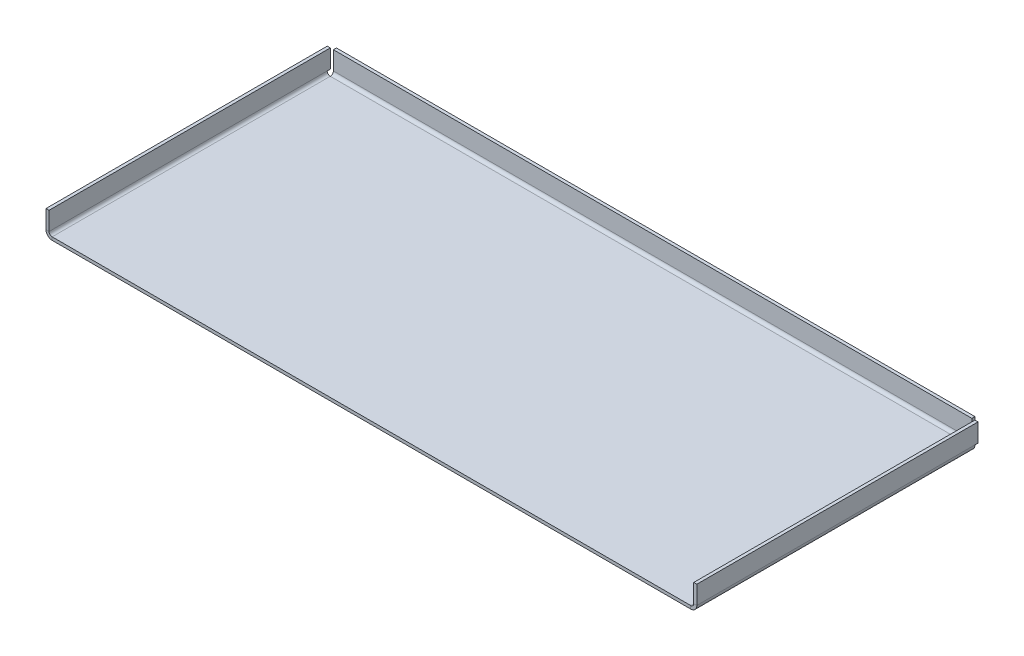
ISO-10303-21;
HEADER;
FILE_DESCRIPTION(('STEP AP214'),'2;1');
FILE_NAME('part.step','',(''),(''),'','','');
FILE_SCHEMA(('AUTOMOTIVE_DESIGN { 1 0 10303 214 1 1 1 1 }'));
ENDSEC;
DATA;
#1=APPLICATION_CONTEXT('core data for automotive mechanical design processes');
#2=APPLICATION_PROTOCOL_DEFINITION('international standard','automotive_design',2000,#1);
#3=PRODUCT_CONTEXT('',#1,'mechanical');
#4=PRODUCT('Part','Part','',(#3));
#5=PRODUCT_RELATED_PRODUCT_CATEGORY('part','',(#4));
#6=PRODUCT_DEFINITION_FORMATION('','',#4);
#7=PRODUCT_DEFINITION_CONTEXT('part definition',#1,'design');
#8=PRODUCT_DEFINITION('design','',#6,#7);
#9=PRODUCT_DEFINITION_SHAPE('','',#8);
#10=(LENGTH_UNIT() NAMED_UNIT(*) SI_UNIT(.MILLI.,.METRE.));
#11=(NAMED_UNIT(*) PLANE_ANGLE_UNIT() SI_UNIT($,.RADIAN.));
#12=(NAMED_UNIT(*) SI_UNIT($,.STERADIAN.) SOLID_ANGLE_UNIT());
#13=UNCERTAINTY_MEASURE_WITH_UNIT(LENGTH_MEASURE(1.E-05),#10,'distance_accuracy_value','');
#14=(GEOMETRIC_REPRESENTATION_CONTEXT(3) GLOBAL_UNCERTAINTY_ASSIGNED_CONTEXT((#13)) GLOBAL_UNIT_ASSIGNED_CONTEXT((#10,
#11,#12)) REPRESENTATION_CONTEXT('',''));
#15=CARTESIAN_POINT('',(0.,0.,0.));
#16=DIRECTION('',(0.,0.,1.));
#17=DIRECTION('',(1.,0.,0.));
#18=AXIS2_PLACEMENT_3D('',#15,#16,#17);
#19=CARTESIAN_POINT('',(0.,3.17499999999998,0.));
#20=DIRECTION('',(0.,-1.,0.));
#21=DIRECTION('',(1.,0.,0.));
#22=AXIS2_PLACEMENT_3D('',#19,#20,#21);
#23=PLANE('',#22);
#24=DIRECTION('',(1.,0.,0.));
#25=VECTOR('',#24,1.);
#26=CARTESIAN_POINT('',(0.,3.17499999999998,-287.655));
#27=LINE('',#26,#25);
#28=CARTESIAN_POINT('',(0.,3.17499999999998,-287.655));
#29=VERTEX_POINT('',#28);
#30=CARTESIAN_POINT('',(3.17499999999999,3.17499999999999,-287.655));
#31=VERTEX_POINT('',#30);
#32=EDGE_CURVE('E13',#29,#31,#27,.T.);
#33=ORIENTED_EDGE('',*,*,#32,.F.);
#34=DIRECTION('',(0.,0.,1.));
#35=VECTOR('',#34,1.);
#36=CARTESIAN_POINT('',(0.,3.17499999999998,0.));
#37=LINE('',#36,#35);
#38=CARTESIAN_POINT('',(0.,3.17499999999998,-290.83));
#39=VERTEX_POINT('',#38);
#40=EDGE_CURVE('E289',#39,#29,#37,.T.);
#41=ORIENTED_EDGE('',*,*,#40,.F.);
#42=DIRECTION('',(1.,0.,0.));
#43=VECTOR('',#42,1.);
#44=CARTESIAN_POINT('',(0.,3.17499999999998,-290.83));
#45=LINE('',#44,#43);
#46=CARTESIAN_POINT('',(3.17499999999999,3.17499999999999,-290.83));
#47=VERTEX_POINT('',#46);
#48=EDGE_CURVE('E265',#47,#39,#45,.F.);
#49=ORIENTED_EDGE('',*,*,#48,.F.);
#50=DIRECTION('',(0.,0.,-1.));
#51=VECTOR('',#50,1.);
#52=CARTESIAN_POINT('',(3.17499999999999,3.17499999999999,-290.83));
#53=LINE('',#52,#51);
#54=EDGE_CURVE('E296',#47,#31,#53,.F.);
#55=ORIENTED_EDGE('',*,*,#54,.T.);
#56=EDGE_LOOP('',(#33,#41,#49,#55));
#57=FACE_BOUND('',#56,.T.);
#58=ADVANCED_FACE('F82',(#57),#23,.T.);
#59=CARTESIAN_POINT('',(6.35000000000001,3.175,0.));
#60=DIRECTION('',(0.,0.,1.));
#61=DIRECTION('',(-1.,0.,0.));
#62=AXIS2_PLACEMENT_3D('',#59,#60,#61);
#63=CYLINDRICAL_SURFACE('',#62,6.34999999999998);
#64=CARTESIAN_POINT('',(0.,3.17499999999998,0.));
#65=VERTEX_POINT('',#64);
#66=EDGE_CURVE('E292',#29,#65,#37,.T.);
#67=ORIENTED_EDGE('',*,*,#66,.F.);
#68=CARTESIAN_POINT('',(6.34999999999997,3.175,-287.655));
#69=DIRECTION('',(0.,0.,-1.));
#70=DIRECTION('',(0.,1.,0.));
#71=AXIS2_PLACEMENT_3D('',#68,#69,#70);
#72=CIRCLE('',#71,6.34999999999998);
#73=CARTESIAN_POINT('',(6.35000000000019,-3.17500000000018,-287.655));
#74=VERTEX_POINT('',#73);
#75=EDGE_CURVE('E375',#29,#74,#72,.F.);
#76=ORIENTED_EDGE('',*,*,#75,.T.);
#77=DIRECTION('',(0.,0.,1.));
#78=VECTOR('',#77,1.);
#79=CARTESIAN_POINT('',(6.34999999999997,-3.17499999999998,0.));
#80=LINE('',#79,#78);
#81=CARTESIAN_POINT('',(6.34999999999997,-3.17499999999998,0.));
#82=VERTEX_POINT('',#81);
#83=EDGE_CURVE('E301',#82,#74,#80,.F.);
#84=ORIENTED_EDGE('',*,*,#83,.F.);
#85=CARTESIAN_POINT('',(6.35000000000001,3.175,0.));
#86=DIRECTION('',(0.,0.,1.));
#87=DIRECTION('',(1.,0.,0.));
#88=AXIS2_PLACEMENT_3D('',#85,#86,#87);
#89=CIRCLE('',#88,6.34999999999998);
#90=EDGE_CURVE('E305',#65,#82,#89,.T.);
#91=ORIENTED_EDGE('',*,*,#90,.F.);
#92=EDGE_LOOP('',(#67,#76,#84,#91));
#93=FACE_BOUND('',#92,.T.);
#94=ADVANCED_FACE('F409',(#93),#63,.T.);
#95=CARTESIAN_POINT('',(0.,3.17500000000342,0.));
#96=DIRECTION('',(0.,1.,0.));
#97=DIRECTION('',(-1.,0.,0.));
#98=AXIS2_PLACEMENT_3D('',#95,#96,#97);
#99=PLANE('',#98);
#100=DIRECTION('',(1.,0.,0.));
#101=VECTOR('',#100,1.);
#102=CARTESIAN_POINT('',(669.93516,3.17500000000004,-287.655));
#103=LINE('',#102,#101);
#104=CARTESIAN_POINT('',(669.93516,3.17500000000004,-287.655));
#105=VERTEX_POINT('',#104);
#106=CARTESIAN_POINT('',(673.11016,3.17500000000002,-287.655));
#107=VERTEX_POINT('',#106);
#108=EDGE_CURVE('E373',#105,#107,#103,.T.);
#109=ORIENTED_EDGE('',*,*,#108,.F.);
#110=DIRECTION('',(0.,0.,-1.));
#111=VECTOR('',#110,1.);
#112=CARTESIAN_POINT('',(669.93516,3.17500000000004,0.));
#113=LINE('',#112,#111);
#114=CARTESIAN_POINT('',(669.93516,3.17500000000004,-290.83));
#115=VERTEX_POINT('',#114);
#116=EDGE_CURVE('E346',#105,#115,#113,.T.);
#117=ORIENTED_EDGE('',*,*,#116,.T.);
#118=DIRECTION('',(-1.,0.,0.));
#119=VECTOR('',#118,1.);
#120=CARTESIAN_POINT('',(669.93516,3.17500000000004,-290.83));
#121=LINE('',#120,#119);
#122=CARTESIAN_POINT('',(673.11016,3.17500000000002,-290.83));
#123=VERTEX_POINT('',#122);
#124=EDGE_CURVE('E341',#115,#123,#121,.F.);
#125=ORIENTED_EDGE('',*,*,#124,.T.);
#126=DIRECTION('',(0.,0.,-1.));
#127=VECTOR('',#126,1.);
#128=CARTESIAN_POINT('',(673.11016,3.17500000000002,0.));
#129=LINE('',#128,#127);
#130=EDGE_CURVE('E337',#123,#107,#129,.F.);
#131=ORIENTED_EDGE('',*,*,#130,.T.);
#132=EDGE_LOOP('',(#109,#117,#125,#131));
#133=FACE_BOUND('',#132,.T.);
#134=ADVANCED_FACE('F448',(#133),#99,.F.);
#135=CARTESIAN_POINT('',(666.76016,3.17500000000005,-290.83));
#136=DIRECTION('',(0.,0.,-1.));
#137=DIRECTION('',(1.,0.,0.));
#138=AXIS2_PLACEMENT_3D('',#135,#136,#137);
#139=CYLINDRICAL_SURFACE('',#138,6.35000000000004);
#140=DIRECTION('',(0.,0.,-1.));
#141=VECTOR('',#140,1.);
#142=CARTESIAN_POINT('',(666.76016,-3.17499999999998,-290.83));
#143=LINE('',#142,#141);
#144=CARTESIAN_POINT('',(666.76016,-3.17499999999998,-287.655));
#145=VERTEX_POINT('',#144);
#146=CARTESIAN_POINT('',(666.76016,-3.175,0.));
#147=VERTEX_POINT('',#146);
#148=EDGE_CURVE('E349',#145,#147,#143,.F.);
#149=ORIENTED_EDGE('',*,*,#148,.F.);
#150=CARTESIAN_POINT('',(666.76016,3.17500000000005,-287.655));
#151=DIRECTION('',(0.,0.,-1.));
#152=DIRECTION('',(0.,1.,0.));
#153=AXIS2_PLACEMENT_3D('',#150,#151,#152);
#154=CIRCLE('',#153,6.35000000000004);
#155=EDGE_CURVE('E370',#145,#107,#154,.F.);
#156=ORIENTED_EDGE('',*,*,#155,.T.);
#157=CARTESIAN_POINT('',(673.11016,3.17500000000002,0.));
#158=VERTEX_POINT('',#157);
#159=EDGE_CURVE('E340',#107,#158,#129,.F.);
#160=ORIENTED_EDGE('',*,*,#159,.T.);
#161=CARTESIAN_POINT('',(666.76016,3.17500000000005,0.));
#162=DIRECTION('',(0.,0.,-1.));
#163=DIRECTION('',(-1.,0.,0.));
#164=AXIS2_PLACEMENT_3D('',#161,#162,#163);
#165=CIRCLE('',#164,6.35000000000004);
#166=EDGE_CURVE('E351',#147,#158,#165,.F.);
#167=ORIENTED_EDGE('',*,*,#166,.F.);
#168=EDGE_LOOP('',(#149,#156,#160,#167));
#169=FACE_BOUND('',#168,.T.);
#170=ADVANCED_FACE('F419',(#169),#139,.T.);
#171=CARTESIAN_POINT('',(666.76016,3.17500000000005,-287.655));
#172=DIRECTION('',(0.,0.,-1.));
#173=DIRECTION('',(0.,1.,0.));
#174=AXIS2_PLACEMENT_3D('',#171,#172,#173);
#175=PLANE('',#174);
#176=CARTESIAN_POINT('',(666.76016,3.17500000000005,-287.655));
#177=DIRECTION('',(0.,0.,-1.));
#178=DIRECTION('',(0.,1.,0.));
#179=AXIS2_PLACEMENT_3D('',#176,#177,#178);
#180=CIRCLE('',#179,3.17500000000004);
#181=CARTESIAN_POINT('',(666.76016,-1.38777878078145E-13,-287.655));
#182=VERTEX_POINT('',#181);
#183=EDGE_CURVE('E365',#182,#105,#180,.F.);
#184=ORIENTED_EDGE('',*,*,#183,.T.);
#185=ORIENTED_EDGE('',*,*,#108,.T.);
#186=ORIENTED_EDGE('',*,*,#155,.F.);
#187=DIRECTION('',(0.,-1.,0.));
#188=VECTOR('',#187,1.);
#189=CARTESIAN_POINT('',(666.76016,-1.38777878078145E-13,-287.655));
#190=LINE('',#189,#188);
#191=EDGE_CURVE('E262',#182,#145,#190,.T.);
#192=ORIENTED_EDGE('',*,*,#191,.F.);
#193=EDGE_LOOP('',(#184,#185,#186,#192));
#194=FACE_BOUND('',#193,.T.);
#195=ADVANCED_FACE('F486',(#194),#175,.T.);
#196=CARTESIAN_POINT('',(0.,-3.175,0.));
#197=DIRECTION('',(0.,-1.,0.));
#198=DIRECTION('',(0.,0.,-1.));
#199=AXIS2_PLACEMENT_3D('',#196,#197,#198);
#200=PLANE('',#199);
#201=ORIENTED_EDGE('',*,*,#83,.T.);
#202=DIRECTION('',(-1.,0.,0.));
#203=VECTOR('',#202,1.);
#204=CARTESIAN_POINT('',(6.34999999999997,-3.17500000000018,-287.655));
#205=LINE('',#204,#203);
#206=EDGE_CURVE('E209',#74,#145,#205,.F.);
#207=ORIENTED_EDGE('',*,*,#206,.T.);
#208=ORIENTED_EDGE('',*,*,#148,.T.);
#209=DIRECTION('',(1.,0.,0.));
#210=VECTOR('',#209,1.);
#211=CARTESIAN_POINT('',(0.,-3.175,0.));
#212=LINE('',#211,#210);
#213=EDGE_CURVE('E362',#82,#147,#212,.T.);
#214=ORIENTED_EDGE('',*,*,#213,.F.);
#215=EDGE_LOOP('',(#201,#207,#208,#214));
#216=FACE_BOUND('',#215,.T.);
#217=ADVANCED_FACE('F415',(#216),#200,.T.);
#218=CARTESIAN_POINT('',(0.,0.,0.));
#219=DIRECTION('',(0.,-1.,0.));
#220=DIRECTION('',(0.,0.,-1.));
#221=AXIS2_PLACEMENT_3D('',#218,#219,#220);
#222=PLANE('',#221);
#223=DIRECTION('',(-1.,0.,0.));
#224=VECTOR('',#223,1.);
#225=CARTESIAN_POINT('',(6.34999999999997,-1.83880688453542E-13,-287.655));
#226=LINE('',#225,#224);
#227=CARTESIAN_POINT('',(6.35000000000019,-1.83880688453542E-13,-287.655));
#228=VERTEX_POINT('',#227);
#229=EDGE_CURVE('E259',#228,#182,#226,.F.);
#230=ORIENTED_EDGE('',*,*,#229,.F.);
#231=DIRECTION('',(0.,0.,1.));
#232=VECTOR('',#231,1.);
#233=CARTESIAN_POINT('',(6.34999999999999,0.,0.));
#234=LINE('',#233,#232);
#235=CARTESIAN_POINT('',(6.34999999999999,0.,0.));
#236=VERTEX_POINT('',#235);
#237=EDGE_CURVE('E308',#236,#228,#234,.F.);
#238=ORIENTED_EDGE('',*,*,#237,.F.);
#239=DIRECTION('',(1.,0.,0.));
#240=VECTOR('',#239,1.);
#241=CARTESIAN_POINT('',(0.,0.,0.));
#242=LINE('',#241,#240);
#243=CARTESIAN_POINT('',(666.76016,0.,0.));
#244=VERTEX_POINT('',#243);
#245=EDGE_CURVE('E361',#236,#244,#242,.T.);
#246=ORIENTED_EDGE('',*,*,#245,.T.);
#247=DIRECTION('',(0.,0.,-1.));
#248=VECTOR('',#247,1.);
#249=CARTESIAN_POINT('',(666.76016,0.,-290.83));
#250=LINE('',#249,#248);
#251=EDGE_CURVE('E319',#182,#244,#250,.F.);
#252=ORIENTED_EDGE('',*,*,#251,.F.);
#253=EDGE_LOOP('',(#230,#238,#246,#252));
#254=FACE_BOUND('',#253,.T.);
#255=ADVANCED_FACE('F383',(#254),#222,.F.);
#256=CARTESIAN_POINT('',(0.,-3.175,0.));
#257=DIRECTION('',(0.,0.,1.));
#258=DIRECTION('',(1.,0.,0.));
#259=AXIS2_PLACEMENT_3D('',#256,#257,#258);
#260=PLANE('',#259);
#261=ORIENTED_EDGE('',*,*,#245,.F.);
#262=DIRECTION('',(0.,-1.,0.));
#263=VECTOR('',#262,1.);
#264=CARTESIAN_POINT('',(6.34999999999999,0.,0.));
#265=LINE('',#264,#263);
#266=EDGE_CURVE('E304',#236,#82,#265,.T.);
#267=ORIENTED_EDGE('',*,*,#266,.T.);
#268=ORIENTED_EDGE('',*,*,#213,.T.);
#269=DIRECTION('',(0.,-1.,0.));
#270=VECTOR('',#269,1.);
#271=CARTESIAN_POINT('',(666.76016,0.,0.));
#272=LINE('',#271,#270);
#273=EDGE_CURVE('E355',#244,#147,#272,.T.);
#274=ORIENTED_EDGE('',*,*,#273,.F.);
#275=EDGE_LOOP('',(#261,#267,#268,#274));
#276=FACE_BOUND('',#275,.T.);
#277=ADVANCED_FACE('F412',(#276),#260,.T.);
#278=CARTESIAN_POINT('',(666.76016,3.17500000000005,0.));
#279=DIRECTION('',(0.,0.,1.));
#280=DIRECTION('',(1.,0.,0.));
#281=AXIS2_PLACEMENT_3D('',#278,#279,#280);
#282=PLANE('',#281);
#283=DIRECTION('',(-1.,0.,0.));
#284=VECTOR('',#283,1.);
#285=CARTESIAN_POINT('',(673.11016,3.17500000000002,0.));
#286=LINE('',#285,#284);
#287=CARTESIAN_POINT('',(669.93516,3.17500000000004,0.));
#288=VERTEX_POINT('',#287);
#289=EDGE_CURVE('E315',#288,#158,#286,.F.);
#290=ORIENTED_EDGE('',*,*,#289,.F.);
#291=CARTESIAN_POINT('',(666.76016,3.17500000000005,0.));
#292=DIRECTION('',(0.,0.,-1.));
#293=DIRECTION('',(-1.,0.,0.));
#294=AXIS2_PLACEMENT_3D('',#291,#292,#293);
#295=CIRCLE('',#294,3.17500000000004);
#296=EDGE_CURVE('E352',#244,#288,#295,.F.);
#297=ORIENTED_EDGE('',*,*,#296,.F.);
#298=ORIENTED_EDGE('',*,*,#273,.T.);
#299=ORIENTED_EDGE('',*,*,#166,.T.);
#300=EDGE_LOOP('',(#290,#297,#298,#299));
#301=FACE_BOUND('',#300,.T.);
#302=ADVANCED_FACE('F423',(#301),#282,.T.);
#303=CARTESIAN_POINT('',(666.76016,3.17500000000005,-290.83));
#304=DIRECTION('',(0.,0.,-1.));
#305=DIRECTION('',(1.,0.,0.));
#306=AXIS2_PLACEMENT_3D('',#303,#304,#305);
#307=CYLINDRICAL_SURFACE('',#306,3.17500000000004);
#308=ORIENTED_EDGE('',*,*,#183,.F.);
#309=ORIENTED_EDGE('',*,*,#251,.T.);
#310=ORIENTED_EDGE('',*,*,#296,.T.);
#311=EDGE_CURVE('E343',#288,#105,#113,.T.);
#312=ORIENTED_EDGE('',*,*,#311,.T.);
#313=EDGE_LOOP('',(#308,#309,#310,#312));
#314=FACE_BOUND('',#313,.T.);
#315=ADVANCED_FACE('F427',(#314),#307,.F.);
#316=CARTESIAN_POINT('',(673.11016,22.225,-290.83));
#317=DIRECTION('',(0.,0.,1.));
#318=DIRECTION('',(1.,0.,0.));
#319=AXIS2_PLACEMENT_3D('',#316,#317,#318);
#320=PLANE('',#319);
#321=ORIENTED_EDGE('',*,*,#124,.F.);
#322=DIRECTION('',(0.,-1.,0.));
#323=VECTOR('',#322,1.);
#324=CARTESIAN_POINT('',(669.93516,22.225,-290.83));
#325=LINE('',#324,#323);
#326=CARTESIAN_POINT('',(669.93516,22.225,-290.83));
#327=VERTEX_POINT('',#326);
#328=EDGE_CURVE('E335',#115,#327,#325,.F.);
#329=ORIENTED_EDGE('',*,*,#328,.T.);
#330=DIRECTION('',(-1.,0.,0.));
#331=VECTOR('',#330,1.);
#332=CARTESIAN_POINT('',(673.11016,22.225,-290.83));
#333=LINE('',#332,#331);
#334=CARTESIAN_POINT('',(673.11016,22.225,-290.83));
#335=VERTEX_POINT('',#334);
#336=EDGE_CURVE('E316',#335,#327,#333,.T.);
#337=ORIENTED_EDGE('',*,*,#336,.F.);
#338=DIRECTION('',(0.,1.,0.));
#339=VECTOR('',#338,1.);
#340=CARTESIAN_POINT('',(673.11016,-3.37352593802528E-12,-290.83));
#341=LINE('',#340,#339);
#342=EDGE_CURVE('E328',#123,#335,#341,.T.);
#343=ORIENTED_EDGE('',*,*,#342,.F.);
#344=EDGE_LOOP('',(#321,#329,#337,#343));
#345=FACE_BOUND('',#344,.T.);
#346=ADVANCED_FACE('F444',(#345),#320,.F.);
#347=CARTESIAN_POINT('',(673.11016,0.,0.));
#348=DIRECTION('',(0.,0.,-1.));
#349=DIRECTION('',(-1.,0.,0.));
#350=AXIS2_PLACEMENT_3D('',#347,#348,#349);
#351=PLANE('',#350);
#352=ORIENTED_EDGE('',*,*,#289,.T.);
#353=DIRECTION('',(0.,-1.,0.));
#354=VECTOR('',#353,1.);
#355=CARTESIAN_POINT('',(673.11016,-3.37352593802528E-12,0.));
#356=LINE('',#355,#354);
#357=CARTESIAN_POINT('',(673.11016,22.225,0.));
#358=VERTEX_POINT('',#357);
#359=EDGE_CURVE('E323',#358,#158,#356,.T.);
#360=ORIENTED_EDGE('',*,*,#359,.F.);
#361=DIRECTION('',(-1.,0.,0.));
#362=VECTOR('',#361,1.);
#363=CARTESIAN_POINT('',(673.11016,22.225,0.));
#364=LINE('',#363,#362);
#365=CARTESIAN_POINT('',(669.93516,22.225,0.));
#366=VERTEX_POINT('',#365);
#367=EDGE_CURVE('E320',#358,#366,#364,.T.);
#368=ORIENTED_EDGE('',*,*,#367,.T.);
#369=DIRECTION('',(0.,1.,0.));
#370=VECTOR('',#369,1.);
#371=CARTESIAN_POINT('',(669.93516,0.,0.));
#372=LINE('',#371,#370);
#373=EDGE_CURVE('E330',#366,#288,#372,.F.);
#374=ORIENTED_EDGE('',*,*,#373,.T.);
#375=EDGE_LOOP('',(#352,#360,#368,#374));
#376=FACE_BOUND('',#375,.T.);
#377=ADVANCED_FACE('F435',(#376),#351,.F.);
#378=CARTESIAN_POINT('',(673.11016,-3.37352593802528E-12,0.));
#379=DIRECTION('',(-1.,0.,0.));
#380=DIRECTION('',(0.,-1.,0.));
#381=AXIS2_PLACEMENT_3D('',#378,#379,#380);
#382=PLANE('',#381);
#383=ORIENTED_EDGE('',*,*,#130,.F.);
#384=ORIENTED_EDGE('',*,*,#342,.T.);
#385=DIRECTION('',(0.,0.,1.));
#386=VECTOR('',#385,1.);
#387=CARTESIAN_POINT('',(673.11016,22.225,0.));
#388=LINE('',#387,#386);
#389=EDGE_CURVE('E326',#335,#358,#388,.T.);
#390=ORIENTED_EDGE('',*,*,#389,.T.);
#391=ORIENTED_EDGE('',*,*,#359,.T.);
#392=ORIENTED_EDGE('',*,*,#159,.F.);
#393=EDGE_LOOP('',(#383,#384,#390,#391,#392));
#394=FACE_BOUND('',#393,.T.);
#395=ADVANCED_FACE('F450',(#394),#382,.F.);
#396=CARTESIAN_POINT('',(669.93516,-3.36244048477446E-12,0.));
#397=DIRECTION('',(-1.,0.,0.));
#398=DIRECTION('',(0.,-1.,0.));
#399=AXIS2_PLACEMENT_3D('',#396,#397,#398);
#400=PLANE('',#399);
#401=ORIENTED_EDGE('',*,*,#328,.F.);
#402=ORIENTED_EDGE('',*,*,#116,.F.);
#403=ORIENTED_EDGE('',*,*,#311,.F.);
#404=ORIENTED_EDGE('',*,*,#373,.F.);
#405=DIRECTION('',(0.,0.,-1.));
#406=VECTOR('',#405,1.);
#407=CARTESIAN_POINT('',(669.93516,22.225,0.));
#408=LINE('',#407,#406);
#409=EDGE_CURVE('E333',#327,#366,#408,.F.);
#410=ORIENTED_EDGE('',*,*,#409,.F.);
#411=EDGE_LOOP('',(#401,#402,#403,#404,#410));
#412=FACE_BOUND('',#411,.T.);
#413=ADVANCED_FACE('F432',(#412),#400,.T.);
#414=CARTESIAN_POINT('',(673.11016,22.225,0.));
#415=DIRECTION('',(0.,-1.,0.));
#416=DIRECTION('',(1.,0.,0.));
#417=AXIS2_PLACEMENT_3D('',#414,#415,#416);
#418=PLANE('',#417);
#419=ORIENTED_EDGE('',*,*,#409,.T.);
#420=ORIENTED_EDGE('',*,*,#367,.F.);
#421=ORIENTED_EDGE('',*,*,#389,.F.);
#422=ORIENTED_EDGE('',*,*,#336,.T.);
#423=EDGE_LOOP('',(#419,#420,#421,#422));
#424=FACE_BOUND('',#423,.T.);
#425=ADVANCED_FACE('F440',(#424),#418,.F.);
#426=CARTESIAN_POINT('',(6.35000000000001,3.175,0.));
#427=DIRECTION('',(0.,0.,-1.));
#428=DIRECTION('',(-1.,0.,0.));
#429=AXIS2_PLACEMENT_3D('',#426,#427,#428);
#430=PLANE('',#429);
#431=CARTESIAN_POINT('',(6.35000000000001,3.175,0.));
#432=DIRECTION('',(0.,0.,1.));
#433=DIRECTION('',(1.,0.,0.));
#434=AXIS2_PLACEMENT_3D('',#431,#432,#433);
#435=CIRCLE('',#434,3.17499999999998);
#436=CARTESIAN_POINT('',(3.17500000000003,3.17499999999999,0.));
#437=VERTEX_POINT('',#436);
#438=EDGE_CURVE('E271',#437,#236,#435,.T.);
#439=ORIENTED_EDGE('',*,*,#438,.F.);
#440=DIRECTION('',(1.,0.,0.));
#441=VECTOR('',#440,1.);
#442=CARTESIAN_POINT('',(3.17499999999999,3.17499999999999,0.));
#443=LINE('',#442,#441);
#444=EDGE_CURVE('E293',#437,#65,#443,.F.);
#445=ORIENTED_EDGE('',*,*,#444,.T.);
#446=ORIENTED_EDGE('',*,*,#90,.T.);
#447=ORIENTED_EDGE('',*,*,#266,.F.);
#448=EDGE_LOOP('',(#439,#445,#446,#447));
#449=FACE_BOUND('',#448,.T.);
#450=ADVANCED_FACE('F391',(#449),#430,.F.);
#451=CARTESIAN_POINT('',(6.34999999999997,3.175,-287.655));
#452=DIRECTION('',(0.,0.,-1.));
#453=DIRECTION('',(0.,1.,0.));
#454=AXIS2_PLACEMENT_3D('',#451,#452,#453);
#455=PLANE('',#454);
#456=ORIENTED_EDGE('',*,*,#75,.F.);
#457=ORIENTED_EDGE('',*,*,#32,.T.);
#458=CARTESIAN_POINT('',(6.34999999999997,3.175,-287.655));
#459=DIRECTION('',(0.,0.,-1.));
#460=DIRECTION('',(0.,1.,0.));
#461=AXIS2_PLACEMENT_3D('',#458,#459,#460);
#462=CIRCLE('',#461,3.17499999999998);
#463=EDGE_CURVE('E89',#31,#228,#462,.F.);
#464=ORIENTED_EDGE('',*,*,#463,.T.);
#465=DIRECTION('',(0.,-1.,0.));
#466=VECTOR('',#465,1.);
#467=CARTESIAN_POINT('',(6.35000000000019,-1.83880688453542E-13,-287.655));
#468=LINE('',#467,#466);
#469=EDGE_CURVE('E255',#228,#74,#468,.T.);
#470=ORIENTED_EDGE('',*,*,#469,.T.);
#471=EDGE_LOOP('',(#456,#457,#464,#470));
#472=FACE_BOUND('',#471,.T.);
#473=ADVANCED_FACE('F377',(#472),#455,.T.);
#474=CARTESIAN_POINT('',(6.35000000000001,3.175,0.));
#475=DIRECTION('',(0.,0.,1.));
#476=DIRECTION('',(-1.,0.,0.));
#477=AXIS2_PLACEMENT_3D('',#474,#475,#476);
#478=CYLINDRICAL_SURFACE('',#477,3.17499999999998);
#479=ORIENTED_EDGE('',*,*,#463,.F.);
#480=EDGE_CURVE('E298',#31,#437,#53,.F.);
#481=ORIENTED_EDGE('',*,*,#480,.T.);
#482=ORIENTED_EDGE('',*,*,#438,.T.);
#483=ORIENTED_EDGE('',*,*,#237,.T.);
#484=EDGE_LOOP('',(#479,#481,#482,#483));
#485=FACE_BOUND('',#484,.T.);
#486=ADVANCED_FACE('F387',(#485),#478,.F.);
#487=CARTESIAN_POINT('',(0.,0.,0.));
#488=DIRECTION('',(0.,0.,-1.));
#489=DIRECTION('',(0.,1.,0.));
#490=AXIS2_PLACEMENT_3D('',#487,#488,#489);
#491=PLANE('',#490);
#492=ORIENTED_EDGE('',*,*,#444,.F.);
#493=DIRECTION('',(0.,1.,0.));
#494=VECTOR('',#493,1.);
#495=CARTESIAN_POINT('',(3.175,0.,0.));
#496=LINE('',#495,#494);
#497=CARTESIAN_POINT('',(3.17499999999992,22.225,0.));
#498=VERTEX_POINT('',#497);
#499=EDGE_CURVE('E287',#437,#498,#496,.T.);
#500=ORIENTED_EDGE('',*,*,#499,.T.);
#501=DIRECTION('',(1.,0.,0.));
#502=VECTOR('',#501,1.);
#503=CARTESIAN_POINT('',(0.,22.225,0.));
#504=LINE('',#503,#502);
#505=CARTESIAN_POINT('',(0.,22.225,0.));
#506=VERTEX_POINT('',#505);
#507=EDGE_CURVE('E268',#506,#498,#504,.T.);
#508=ORIENTED_EDGE('',*,*,#507,.F.);
#509=DIRECTION('',(0.,-1.,0.));
#510=VECTOR('',#509,1.);
#511=CARTESIAN_POINT('',(0.,0.,0.));
#512=LINE('',#511,#510);
#513=EDGE_CURVE('E280',#65,#506,#512,.F.);
#514=ORIENTED_EDGE('',*,*,#513,.F.);
#515=EDGE_LOOP('',(#492,#500,#508,#514));
#516=FACE_BOUND('',#515,.T.);
#517=ADVANCED_FACE('F401',(#516),#491,.F.);
#518=CARTESIAN_POINT('',(0.,22.225,-290.83));
#519=DIRECTION('',(0.,0.,1.));
#520=DIRECTION('',(1.,0.,0.));
#521=AXIS2_PLACEMENT_3D('',#518,#519,#520);
#522=PLANE('',#521);
#523=ORIENTED_EDGE('',*,*,#48,.T.);
#524=DIRECTION('',(0.,1.,0.));
#525=VECTOR('',#524,1.);
#526=CARTESIAN_POINT('',(0.,0.,-290.83));
#527=LINE('',#526,#525);
#528=CARTESIAN_POINT('',(0.,22.225,-290.83));
#529=VERTEX_POINT('',#528);
#530=EDGE_CURVE('E275',#529,#39,#527,.F.);
#531=ORIENTED_EDGE('',*,*,#530,.F.);
#532=DIRECTION('',(1.,0.,0.));
#533=VECTOR('',#532,1.);
#534=CARTESIAN_POINT('',(0.,22.225,-290.83));
#535=LINE('',#534,#533);
#536=CARTESIAN_POINT('',(3.17499999999992,22.225,-290.83));
#537=VERTEX_POINT('',#536);
#538=EDGE_CURVE('E272',#529,#537,#535,.T.);
#539=ORIENTED_EDGE('',*,*,#538,.T.);
#540=DIRECTION('',(0.,-1.,0.));
#541=VECTOR('',#540,1.);
#542=CARTESIAN_POINT('',(3.17499999999992,22.225,-290.83));
#543=LINE('',#542,#541);
#544=EDGE_CURVE('E282',#537,#47,#543,.T.);
#545=ORIENTED_EDGE('',*,*,#544,.T.);
#546=EDGE_LOOP('',(#523,#531,#539,#545));
#547=FACE_BOUND('',#546,.T.);
#548=ADVANCED_FACE('F542',(#547),#522,.F.);
#549=CARTESIAN_POINT('',(0.,0.,0.));
#550=DIRECTION('',(-1.,0.,0.));
#551=DIRECTION('',(0.,-1.,0.));
#552=AXIS2_PLACEMENT_3D('',#549,#550,#551);
#553=PLANE('',#552);
#554=ORIENTED_EDGE('',*,*,#530,.T.);
#555=ORIENTED_EDGE('',*,*,#40,.T.);
#556=ORIENTED_EDGE('',*,*,#66,.T.);
#557=ORIENTED_EDGE('',*,*,#513,.T.);
#558=DIRECTION('',(0.,0.,1.));
#559=VECTOR('',#558,1.);
#560=CARTESIAN_POINT('',(0.,22.225,0.));
#561=LINE('',#560,#559);
#562=EDGE_CURVE('E278',#506,#529,#561,.F.);
#563=ORIENTED_EDGE('',*,*,#562,.T.);
#564=EDGE_LOOP('',(#554,#555,#556,#557,#563));
#565=FACE_BOUND('',#564,.T.);
#566=ADVANCED_FACE('F404',(#565),#553,.T.);
#567=CARTESIAN_POINT('',(3.175,0.,0.));
#568=DIRECTION('',(-1.,0.,0.));
#569=DIRECTION('',(0.,-1.,0.));
#570=AXIS2_PLACEMENT_3D('',#567,#568,#569);
#571=PLANE('',#570);
#572=ORIENTED_EDGE('',*,*,#54,.F.);
#573=ORIENTED_EDGE('',*,*,#544,.F.);
#574=DIRECTION('',(0.,0.,-1.));
#575=VECTOR('',#574,1.);
#576=CARTESIAN_POINT('',(3.17499999999992,22.225,0.));
#577=LINE('',#576,#575);
#578=EDGE_CURVE('E285',#498,#537,#577,.T.);
#579=ORIENTED_EDGE('',*,*,#578,.F.);
#580=ORIENTED_EDGE('',*,*,#499,.F.);
#581=ORIENTED_EDGE('',*,*,#480,.F.);
#582=EDGE_LOOP('',(#572,#573,#579,#580,#581));
#583=FACE_BOUND('',#582,.T.);
#584=ADVANCED_FACE('F397',(#583),#571,.F.);
#585=CARTESIAN_POINT('',(0.,22.225,0.));
#586=DIRECTION('',(0.,-1.,0.));
#587=DIRECTION('',(1.,0.,0.));
#588=AXIS2_PLACEMENT_3D('',#585,#586,#587);
#589=PLANE('',#588);
#590=ORIENTED_EDGE('',*,*,#578,.T.);
#591=ORIENTED_EDGE('',*,*,#538,.F.);
#592=ORIENTED_EDGE('',*,*,#562,.F.);
#593=ORIENTED_EDGE('',*,*,#507,.T.);
#594=EDGE_LOOP('',(#590,#591,#592,#593));
#595=FACE_BOUND('',#594,.T.);
#596=ADVANCED_FACE('F537',(#595),#589,.F.);
#597=CARTESIAN_POINT('',(666.76016,3.17499999999996,-287.655));
#598=DIRECTION('',(1.,0.,0.));
#599=DIRECTION('',(0.,1.,0.));
#600=AXIS2_PLACEMENT_3D('',#597,#598,#599);
#601=PLANE('',#600);
#602=DIRECTION('',(0.,0.,-1.));
#603=VECTOR('',#602,1.);
#604=CARTESIAN_POINT('',(666.76016,3.17499999999998,-290.83));
#605=LINE('',#604,#603);
#606=CARTESIAN_POINT('',(666.76016,3.17499999999995,-290.83));
#607=VERTEX_POINT('',#606);
#608=CARTESIAN_POINT('',(666.76016,3.17499999999994,-294.005));
#609=VERTEX_POINT('',#608);
#610=EDGE_CURVE('E506',#607,#609,#605,.T.);
#611=ORIENTED_EDGE('',*,*,#610,.F.);
#612=CARTESIAN_POINT('',(666.76016,3.17499999999996,-287.655));
#613=DIRECTION('',(-1.,0.,0.));
#614=DIRECTION('',(0.,-1.,0.));
#615=AXIS2_PLACEMENT_3D('',#612,#613,#614);
#616=CIRCLE('',#615,3.17500000000009);
#617=EDGE_CURVE('E212',#182,#607,#616,.F.);
#618=ORIENTED_EDGE('',*,*,#617,.F.);
#619=ORIENTED_EDGE('',*,*,#191,.T.);
#620=CARTESIAN_POINT('',(666.76016,3.17499999999996,-287.655));
#621=DIRECTION('',(-1.,0.,0.));
#622=DIRECTION('',(0.,-1.,0.));
#623=AXIS2_PLACEMENT_3D('',#620,#621,#622);
#624=CIRCLE('',#623,6.35000000000009);
#625=EDGE_CURVE('E254',#145,#609,#624,.F.);
#626=ORIENTED_EDGE('',*,*,#625,.T.);
#627=EDGE_LOOP('',(#611,#618,#619,#626));
#628=FACE_BOUND('',#627,.T.);
#629=ADVANCED_FACE('F504',(#628),#601,.T.);
#630=CARTESIAN_POINT('',(6.35000000000019,3.17499999999991,-287.655));
#631=DIRECTION('',(1.,0.,0.));
#632=DIRECTION('',(0.,1.,0.));
#633=AXIS2_PLACEMENT_3D('',#630,#631,#632);
#634=PLANE('',#633);
#635=CARTESIAN_POINT('',(6.35000000000019,3.17499999999991,-287.655));
#636=DIRECTION('',(-1.,0.,0.));
#637=DIRECTION('',(0.,-1.,0.));
#638=AXIS2_PLACEMENT_3D('',#635,#636,#637);
#639=CIRCLE('',#638,3.17500000000009);
#640=CARTESIAN_POINT('',(6.35000000000019,3.1749999999999,-290.83));
#641=VERTEX_POINT('',#640);
#642=EDGE_CURVE('E219',#641,#228,#639,.T.);
#643=ORIENTED_EDGE('',*,*,#642,.F.);
#644=DIRECTION('',(0.,0.,-1.));
#645=VECTOR('',#644,1.);
#646=CARTESIAN_POINT('',(6.35000000000019,3.17499999999993,-290.83));
#647=LINE('',#646,#645);
#648=CARTESIAN_POINT('',(6.35000000000019,3.17499999999995,-294.005));
#649=VERTEX_POINT('',#648);
#650=EDGE_CURVE('E216',#641,#649,#647,.T.);
#651=ORIENTED_EDGE('',*,*,#650,.T.);
#652=CARTESIAN_POINT('',(6.35000000000019,3.17499999999991,-287.655));
#653=DIRECTION('',(-1.,0.,0.));
#654=DIRECTION('',(0.,-1.,0.));
#655=AXIS2_PLACEMENT_3D('',#652,#653,#654);
#656=CIRCLE('',#655,6.35000000000009);
#657=EDGE_CURVE('E202',#649,#74,#656,.T.);
#658=ORIENTED_EDGE('',*,*,#657,.T.);
#659=ORIENTED_EDGE('',*,*,#469,.F.);
#660=EDGE_LOOP('',(#643,#651,#658,#659));
#661=FACE_BOUND('',#660,.T.);
#662=ADVANCED_FACE('F217',(#661),#634,.F.);
#663=CARTESIAN_POINT('',(6.34999999999997,3.17499999999991,-287.655));
#664=DIRECTION('',(-1.,0.,0.));
#665=DIRECTION('',(0.,0.,-1.));
#666=AXIS2_PLACEMENT_3D('',#663,#664,#665);
#667=CYLINDRICAL_SURFACE('',#666,6.35000000000009);
#668=ORIENTED_EDGE('',*,*,#206,.F.);
#669=ORIENTED_EDGE('',*,*,#657,.F.);
#670=DIRECTION('',(1.,0.,0.));
#671=VECTOR('',#670,1.);
#672=CARTESIAN_POINT('',(0.,3.17499999999995,-294.005));
#673=LINE('',#672,#671);
#674=EDGE_CURVE('E206',#649,#609,#673,.T.);
#675=ORIENTED_EDGE('',*,*,#674,.T.);
#676=ORIENTED_EDGE('',*,*,#625,.F.);
#677=EDGE_LOOP('',(#668,#669,#675,#676));
#678=FACE_BOUND('',#677,.T.);
#679=ADVANCED_FACE('F204',(#678),#667,.T.);
#680=CARTESIAN_POINT('',(6.34999999999997,3.17499999999991,-287.655));
#681=DIRECTION('',(-1.,0.,0.));
#682=DIRECTION('',(0.,0.,-1.));
#683=AXIS2_PLACEMENT_3D('',#680,#681,#682);
#684=CYLINDRICAL_SURFACE('',#683,3.17500000000009);
#685=ORIENTED_EDGE('',*,*,#229,.T.);
#686=ORIENTED_EDGE('',*,*,#617,.T.);
#687=DIRECTION('',(-1.,0.,0.));
#688=VECTOR('',#687,1.);
#689=CARTESIAN_POINT('',(666.76016,3.17499999999998,-290.83));
#690=LINE('',#689,#688);
#691=EDGE_CURVE('E223',#607,#641,#690,.T.);
#692=ORIENTED_EDGE('',*,*,#691,.T.);
#693=ORIENTED_EDGE('',*,*,#642,.T.);
#694=EDGE_LOOP('',(#685,#686,#692,#693));
#695=FACE_BOUND('',#694,.T.);
#696=ADVANCED_FACE('F508',(#695),#684,.F.);
#697=CARTESIAN_POINT('',(666.76016,0.,-294.005));
#698=DIRECTION('',(-1.,0.,0.));
#699=DIRECTION('',(0.,0.,1.));
#700=AXIS2_PLACEMENT_3D('',#697,#698,#699);
#701=PLANE('',#700);
#702=ORIENTED_EDGE('',*,*,#610,.T.);
#703=DIRECTION('',(0.,-1.,0.));
#704=VECTOR('',#703,1.);
#705=CARTESIAN_POINT('',(666.76016,0.,-294.005));
#706=LINE('',#705,#704);
#707=CARTESIAN_POINT('',(666.76016,22.225,-294.005));
#708=VERTEX_POINT('',#707);
#709=EDGE_CURVE('E231',#708,#609,#706,.T.);
#710=ORIENTED_EDGE('',*,*,#709,.F.);
#711=DIRECTION('',(0.,0.,1.));
#712=VECTOR('',#711,1.);
#713=CARTESIAN_POINT('',(666.76016,22.225,-294.005));
#714=LINE('',#713,#712);
#715=CARTESIAN_POINT('',(666.76016,22.225,-290.83));
#716=VERTEX_POINT('',#715);
#717=EDGE_CURVE('E240',#708,#716,#714,.T.);
#718=ORIENTED_EDGE('',*,*,#717,.T.);
#719=DIRECTION('',(0.,-1.,0.));
#720=VECTOR('',#719,1.);
#721=CARTESIAN_POINT('',(666.76016,0.,-290.83));
#722=LINE('',#721,#720);
#723=EDGE_CURVE('E232',#716,#607,#722,.T.);
#724=ORIENTED_EDGE('',*,*,#723,.T.);
#725=EDGE_LOOP('',(#702,#710,#718,#724));
#726=FACE_BOUND('',#725,.T.);
#727=ADVANCED_FACE('F515',(#726),#701,.F.);
#728=CARTESIAN_POINT('',(6.34999999999997,22.225,-294.005));
#729=DIRECTION('',(1.,0.,0.));
#730=DIRECTION('',(0.,1.,0.));
#731=AXIS2_PLACEMENT_3D('',#728,#729,#730);
#732=PLANE('',#731);
#733=ORIENTED_EDGE('',*,*,#650,.F.);
#734=DIRECTION('',(0.,1.,0.));
#735=VECTOR('',#734,1.);
#736=CARTESIAN_POINT('',(6.34999999999997,22.225,-290.83));
#737=LINE('',#736,#735);
#738=CARTESIAN_POINT('',(6.34999999999997,22.225,-290.83));
#739=VERTEX_POINT('',#738);
#740=EDGE_CURVE('E247',#641,#739,#737,.T.);
#741=ORIENTED_EDGE('',*,*,#740,.T.);
#742=DIRECTION('',(0.,0.,1.));
#743=VECTOR('',#742,1.);
#744=CARTESIAN_POINT('',(6.34999999999997,22.225,-294.005));
#745=LINE('',#744,#743);
#746=CARTESIAN_POINT('',(6.34999999999997,22.225,-294.005));
#747=VERTEX_POINT('',#746);
#748=EDGE_CURVE('E236',#747,#739,#745,.T.);
#749=ORIENTED_EDGE('',*,*,#748,.F.);
#750=DIRECTION('',(0.,1.,0.));
#751=VECTOR('',#750,1.);
#752=CARTESIAN_POINT('',(6.34999999999997,22.225,-294.005));
#753=LINE('',#752,#751);
#754=EDGE_CURVE('E228',#649,#747,#753,.T.);
#755=ORIENTED_EDGE('',*,*,#754,.F.);
#756=EDGE_LOOP('',(#733,#741,#749,#755));
#757=FACE_BOUND('',#756,.T.);
#758=ADVANCED_FACE('F234',(#757),#732,.F.);
#759=CARTESIAN_POINT('',(0.,-7.37488517934143E-13,-294.005));
#760=DIRECTION('',(0.,0.,1.));
#761=DIRECTION('',(0.,-1.,0.));
#762=AXIS2_PLACEMENT_3D('',#759,#760,#761);
#763=PLANE('',#762);
#764=ORIENTED_EDGE('',*,*,#674,.F.);
#765=ORIENTED_EDGE('',*,*,#754,.T.);
#766=DIRECTION('',(1.,0.,0.));
#767=VECTOR('',#766,1.);
#768=CARTESIAN_POINT('',(666.76016,22.225,-294.005));
#769=LINE('',#768,#767);
#770=EDGE_CURVE('E238',#747,#708,#769,.T.);
#771=ORIENTED_EDGE('',*,*,#770,.T.);
#772=ORIENTED_EDGE('',*,*,#709,.T.);
#773=EDGE_LOOP('',(#764,#765,#771,#772));
#774=FACE_BOUND('',#773,.T.);
#775=ADVANCED_FACE('F227',(#774),#763,.F.);
#776=CARTESIAN_POINT('',(0.,-7.26403064683316E-13,-290.83));
#777=DIRECTION('',(0.,0.,1.));
#778=DIRECTION('',(0.,-1.,0.));
#779=AXIS2_PLACEMENT_3D('',#776,#777,#778);
#780=PLANE('',#779);
#781=ORIENTED_EDGE('',*,*,#740,.F.);
#782=ORIENTED_EDGE('',*,*,#691,.F.);
#783=ORIENTED_EDGE('',*,*,#723,.F.);
#784=DIRECTION('',(1.,0.,0.));
#785=VECTOR('',#784,1.);
#786=CARTESIAN_POINT('',(666.76016,22.225,-290.83));
#787=LINE('',#786,#785);
#788=EDGE_CURVE('E242',#739,#716,#787,.T.);
#789=ORIENTED_EDGE('',*,*,#788,.F.);
#790=EDGE_LOOP('',(#781,#782,#783,#789));
#791=FACE_BOUND('',#790,.T.);
#792=ADVANCED_FACE('F511',(#791),#780,.T.);
#793=CARTESIAN_POINT('',(666.76016,22.225,-294.005));
#794=DIRECTION('',(0.,-1.,0.));
#795=DIRECTION('',(0.,0.,-1.));
#796=AXIS2_PLACEMENT_3D('',#793,#794,#795);
#797=PLANE('',#796);
#798=ORIENTED_EDGE('',*,*,#788,.T.);
#799=ORIENTED_EDGE('',*,*,#717,.F.);
#800=ORIENTED_EDGE('',*,*,#770,.F.);
#801=ORIENTED_EDGE('',*,*,#748,.T.);
#802=EDGE_LOOP('',(#798,#799,#800,#801));
#803=FACE_BOUND('',#802,.T.);
#804=ADVANCED_FACE('F518',(#803),#797,.F.);
#805=CLOSED_SHELL('',(#58,#94,#134,#170,#195,#217,#255,#277,#302,#315,#346,#377,#395,#413,#425,
#450,#473,#486,#517,#548,#566,#584,#596,#629,#662,#679,#696,#727,#758,#775,#792,#804));
#806=MANIFOLD_SOLID_BREP('B2',#805);
#807=ADVANCED_BREP_SHAPE_REPRESENTATION('',(#18,#806),#14);
#808=SHAPE_DEFINITION_REPRESENTATION(#9,#807);
ENDSEC;
END-ISO-10303-21;
